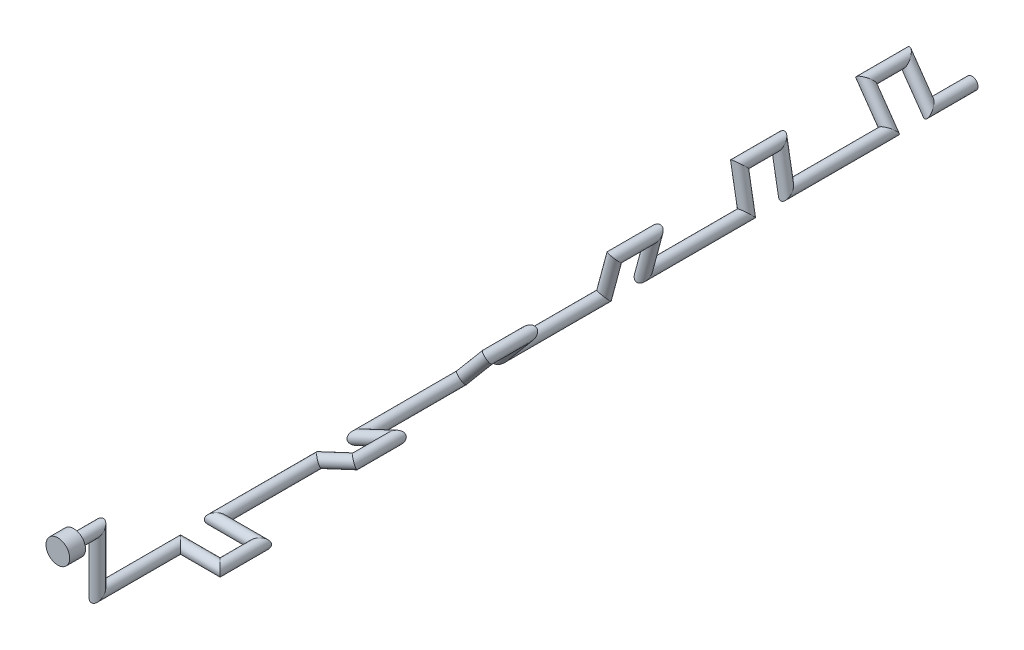
ISO-10303-21;
HEADER;
FILE_DESCRIPTION(('STEP AP214'),'2;1');
FILE_NAME('part.step','',(''),(''),'','','');
FILE_SCHEMA(('AUTOMOTIVE_DESIGN { 1 0 10303 214 1 1 1 1 }'));
ENDSEC;
DATA;
#1=APPLICATION_CONTEXT('core data for automotive mechanical design processes');
#2=APPLICATION_PROTOCOL_DEFINITION('international standard','automotive_design',2000,#1);
#3=PRODUCT_CONTEXT('',#1,'mechanical');
#4=PRODUCT('Part','Part','',(#3));
#5=PRODUCT_RELATED_PRODUCT_CATEGORY('part','',(#4));
#6=PRODUCT_DEFINITION_FORMATION('','',#4);
#7=PRODUCT_DEFINITION_CONTEXT('part definition',#1,'design');
#8=PRODUCT_DEFINITION('design','',#6,#7);
#9=PRODUCT_DEFINITION_SHAPE('','',#8);
#10=(LENGTH_UNIT() NAMED_UNIT(*) SI_UNIT(.MILLI.,.METRE.));
#11=(NAMED_UNIT(*) PLANE_ANGLE_UNIT() SI_UNIT($,.RADIAN.));
#12=(NAMED_UNIT(*) SI_UNIT($,.STERADIAN.) SOLID_ANGLE_UNIT());
#13=UNCERTAINTY_MEASURE_WITH_UNIT(LENGTH_MEASURE(1.E-05),#10,'distance_accuracy_value','');
#14=(GEOMETRIC_REPRESENTATION_CONTEXT(3) GLOBAL_UNCERTAINTY_ASSIGNED_CONTEXT((#13)) GLOBAL_UNIT_ASSIGNED_CONTEXT((#10,
#11,#12)) REPRESENTATION_CONTEXT('',''));
#15=CARTESIAN_POINT('',(0.,0.,0.));
#16=DIRECTION('',(0.,0.,1.));
#17=DIRECTION('',(1.,0.,0.));
#18=AXIS2_PLACEMENT_3D('',#15,#16,#17);
#19=CARTESIAN_POINT('',(0.,177.8,50.8));
#20=DIRECTION('',(0.,0.,-1.));
#21=DIRECTION('',(-1.,0.,0.));
#22=AXIS2_PLACEMENT_3D('',#19,#20,#21);
#23=CYLINDRICAL_SURFACE('',#22,38.1);
#24=CARTESIAN_POINT('',(0.,177.8,50.8));
#25=DIRECTION('',(0.,0.,1.));
#26=DIRECTION('',(1.,0.,0.));
#27=AXIS2_PLACEMENT_3D('',#24,#25,#26);
#28=CIRCLE('',#27,38.1);
#29=CARTESIAN_POINT('',(38.1,177.8,50.8));
#30=VERTEX_POINT('',#29);
#31=EDGE_CURVE('E41',#30,#30,#28,.T.);
#32=ORIENTED_EDGE('',*,*,#31,.F.);
#33=EDGE_LOOP('',(#32));
#34=FACE_BOUND('',#33,.T.);
#35=CARTESIAN_POINT('',(0.,177.8,0.));
#36=DIRECTION('',(0.,0.,1.));
#37=DIRECTION('',(1.,0.,0.));
#38=AXIS2_PLACEMENT_3D('',#35,#36,#37);
#39=CIRCLE('',#38,38.1);
#40=CARTESIAN_POINT('',(38.1,177.8,0.));
#41=VERTEX_POINT('',#40);
#42=EDGE_CURVE('E45',#41,#41,#39,.T.);
#43=ORIENTED_EDGE('',*,*,#42,.T.);
#44=EDGE_LOOP('',(#43));
#45=FACE_BOUND('',#44,.T.);
#46=ADVANCED_FACE('F30',(#34,#45),#23,.T.);
#47=CARTESIAN_POINT('',(0.,177.8,50.8));
#48=DIRECTION('',(0.,0.,1.));
#49=DIRECTION('',(1.,0.,0.));
#50=AXIS2_PLACEMENT_3D('',#47,#48,#49);
#51=PLANE('',#50);
#52=ORIENTED_EDGE('',*,*,#31,.T.);
#53=EDGE_LOOP('',(#52));
#54=FACE_BOUND('',#53,.T.);
#55=ADVANCED_FACE('F288',(#54),#51,.T.);
#56=CARTESIAN_POINT('',(0.,177.8,0.));
#57=DIRECTION('',(0.,0.,1.));
#58=DIRECTION('',(1.,0.,0.));
#59=AXIS2_PLACEMENT_3D('',#56,#57,#58);
#60=PLANE('',#59);
#61=CARTESIAN_POINT('',(0.,177.8,0.));
#62=DIRECTION('',(0.,0.,1.));
#63=DIRECTION('',(1.,0.,0.));
#64=AXIS2_PLACEMENT_3D('',#61,#62,#63);
#65=CIRCLE('',#64,31.75);
#66=CARTESIAN_POINT('',(31.75,177.8,0.));
#67=VERTEX_POINT('',#66);
#68=EDGE_CURVE('E10',#67,#67,#65,.T.);
#69=ORIENTED_EDGE('',*,*,#68,.T.);
#70=EDGE_LOOP('',(#69));
#71=FACE_BOUND('',#70,.T.);
#72=ORIENTED_EDGE('',*,*,#42,.F.);
#73=EDGE_LOOP('',(#72));
#74=FACE_BOUND('',#73,.T.);
#75=ADVANCED_FACE('F293',(#71,#74),#60,.F.);
#76=CARTESIAN_POINT('',(0.,0.,-34.19));
#77=DIRECTION('',(0.,0.,-1.));
#78=DIRECTION('',(0.,1.,0.));
#79=AXIS2_PLACEMENT_3D('',#76,#77,#78);
#80=CYLINDRICAL_SURFACE('',#79,19.05);
#81=CARTESIAN_POINT('',(0.,0.,-76.2));
#82=DIRECTION('',(0.,-0.707106781186548,-0.707106781186548));
#83=DIRECTION('',(0.,-0.707106781186548,0.707106781186548));
#84=AXIS2_PLACEMENT_3D('',#81,#82,#83);
#85=ELLIPSE('',#84,26.9407683632075,19.05);
#86=CARTESIAN_POINT('',(0.,-19.05,-57.15));
#87=VERTEX_POINT('',#86);
#88=EDGE_CURVE('E51',#87,#87,#85,.F.);
#89=ORIENTED_EDGE('',*,*,#88,.F.);
#90=EDGE_LOOP('',(#89));
#91=FACE_BOUND('',#90,.T.);
#92=CARTESIAN_POINT('',(0.,0.,-342.9));
#93=DIRECTION('',(0.707106781186547,0.,-0.707106781186547));
#94=DIRECTION('',(-0.707106781186548,0.,-0.707106781186548));
#95=AXIS2_PLACEMENT_3D('',#92,#93,#94);
#96=ELLIPSE('',#95,26.9407683632075,19.05);
#97=CARTESIAN_POINT('',(-19.05,0.,-361.95));
#98=VERTEX_POINT('',#97);
#99=EDGE_CURVE('E54',#98,#98,#96,.F.);
#100=ORIENTED_EDGE('',*,*,#99,.T.);
#101=EDGE_LOOP('',(#100));
#102=FACE_BOUND('',#101,.T.);
#103=ADVANCED_FACE('F132',(#91,#102),#80,.T.);
#104=CARTESIAN_POINT('',(0.,219.81,-76.2));
#105=DIRECTION('',(0.,-1.,0.));
#106=DIRECTION('',(0.,0.,-1.));
#107=AXIS2_PLACEMENT_3D('',#104,#105,#106);
#108=CYLINDRICAL_SURFACE('',#107,19.05);
#109=CARTESIAN_POINT('',(0.,177.8,-76.2));
#110=DIRECTION('',(0.,-0.707106781186548,-0.707106781186547));
#111=DIRECTION('',(0.,0.707106781186547,-0.707106781186548));
#112=AXIS2_PLACEMENT_3D('',#109,#110,#111);
#113=ELLIPSE('',#112,26.9407683632075,19.05);
#114=CARTESIAN_POINT('',(0.,196.85,-95.25));
#115=VERTEX_POINT('',#114);
#116=EDGE_CURVE('E49',#115,#115,#113,.F.);
#117=ORIENTED_EDGE('',*,*,#116,.F.);
#118=EDGE_LOOP('',(#117));
#119=FACE_BOUND('',#118,.T.);
#120=ORIENTED_EDGE('',*,*,#88,.T.);
#121=EDGE_LOOP('',(#120));
#122=FACE_BOUND('',#121,.T.);
#123=ADVANCED_FACE('F303',(#119,#122),#108,.T.);
#124=CARTESIAN_POINT('',(0.,177.8,0.));
#125=DIRECTION('',(0.,0.,-1.));
#126=DIRECTION('',(-1.,0.,0.));
#127=AXIS2_PLACEMENT_3D('',#124,#125,#126);
#128=CYLINDRICAL_SURFACE('',#127,19.05);
#129=CARTESIAN_POINT('',(0.,177.8,-12.7));
#130=DIRECTION('',(0.,0.,1.));
#131=DIRECTION('',(1.,0.,0.));
#132=AXIS2_PLACEMENT_3D('',#129,#130,#131);
#133=CIRCLE('',#132,19.05);
#134=CARTESIAN_POINT('',(19.05,177.8,-12.7));
#135=VERTEX_POINT('',#134);
#136=EDGE_CURVE('E37',#135,#135,#133,.F.);
#137=ORIENTED_EDGE('',*,*,#136,.T.);
#138=EDGE_LOOP('',(#137));
#139=FACE_BOUND('',#138,.T.);
#140=ORIENTED_EDGE('',*,*,#116,.T.);
#141=EDGE_LOOP('',(#140));
#142=FACE_BOUND('',#141,.T.);
#143=ADVANCED_FACE('F284',(#139,#142),#128,.T.);
#144=CARTESIAN_POINT('',(0.,177.8,-12.7));
#145=DIRECTION('',(0.,0.,1.));
#146=DIRECTION('',(1.,0.,0.));
#147=AXIS2_PLACEMENT_3D('',#144,#145,#146);
#148=TOROIDAL_SURFACE('',#147,31.75,12.7);
#149=ORIENTED_EDGE('',*,*,#68,.F.);
#150=EDGE_LOOP('',(#149));
#151=FACE_BOUND('',#150,.T.);
#152=ORIENTED_EDGE('',*,*,#136,.F.);
#153=EDGE_LOOP('',(#152));
#154=FACE_BOUND('',#153,.T.);
#155=ADVANCED_FACE('F32',(#151,#154),#148,.F.);
#156=CARTESIAN_POINT('',(-12.6999999999993,0.,-2895.6));
#157=DIRECTION('',(0.,0.,-1.));
#158=DIRECTION('',(-1.,0.,0.));
#159=AXIS2_PLACEMENT_3D('',#156,#157,#158);
#160=PLANE('',#159);
#161=CARTESIAN_POINT('',(-12.6999999999993,0.,-2895.6));
#162=DIRECTION('',(0.,0.,-1.));
#163=DIRECTION('',(-1.,0.,0.));
#164=AXIS2_PLACEMENT_3D('',#161,#162,#163);
#165=CIRCLE('',#164,19.05);
#166=CARTESIAN_POINT('',(-31.7499999999993,0.,-2895.6));
#167=VERTEX_POINT('',#166);
#168=EDGE_CURVE('E57',#167,#167,#165,.T.);
#169=ORIENTED_EDGE('',*,*,#168,.T.);
#170=EDGE_LOOP('',(#169));
#171=FACE_BOUND('',#170,.T.);
#172=ADVANCED_FACE('F275',(#171),#160,.T.);
#173=CARTESIAN_POINT('',(-12.6999999999993,0.,-2709.45004360013));
#174=DIRECTION('',(0.,0.,-1.));
#175=DIRECTION('',(0.,1.,0.));
#176=AXIS2_PLACEMENT_3D('',#173,#174,#175);
#177=CYLINDRICAL_SURFACE('',#176,19.05);
#178=CARTESIAN_POINT('',(-12.6999999999994,3.60822483003176E-13,-2755.9));
#179=DIRECTION('',(0.405579787672585,-0.57922796533948,-0.707106781186651));
#180=DIRECTION('',(0.405579787672705,-0.57922796533965,0.707106781186444));
#181=AXIS2_PLACEMENT_3D('',#178,#179,#180);
#182=ELLIPSE('',#181,26.9407683632035,19.05);
#183=CARTESIAN_POINT('',(-1.77336888751184,-15.6048464437048,-2736.85000000001));
#184=VERTEX_POINT('',#183);
#185=EDGE_CURVE('E60',#184,#184,#182,.F.);
#186=ORIENTED_EDGE('',*,*,#185,.F.);
#187=EDGE_LOOP('',(#186));
#188=FACE_BOUND('',#187,.T.);
#189=ORIENTED_EDGE('',*,*,#168,.F.);
#190=EDGE_LOOP('',(#189));
#191=FACE_BOUND('',#190,.T.);
#192=ADVANCED_FACE('F269',(#188,#191),#177,.T.);
#193=CARTESIAN_POINT('',(-112.186807877084,142.081886366792,-2755.89999999995));
#194=DIRECTION('',(0.573576436351055,-0.819152044288986,-2.93728296278784E-13));
#195=DIRECTION('',(0.819152044288986,0.573576436351055,0.));
#196=AXIS2_PLACEMENT_3D('',#193,#194,#195);
#197=CYLINDRICAL_SURFACE('',#196,19.05);
#198=CARTESIAN_POINT('',(-85.5442074165833,104.032309624701,-2755.89999999996));
#199=DIRECTION('',(0.405579787672586,-0.57922796533948,-0.707106781186651));
#200=DIRECTION('',(-0.405579787672705,0.57922796533965,-0.707106781186444));
#201=AXIS2_PLACEMENT_3D('',#198,#199,#200);
#202=ELLIPSE('',#201,26.9407683632035,19.05);
#203=CARTESIAN_POINT('',(-96.4708385290709,119.637156068406,-2774.94999999996));
#204=VERTEX_POINT('',#203);
#205=EDGE_CURVE('E63',#204,#204,#202,.F.);
#206=ORIENTED_EDGE('',*,*,#205,.F.);
#207=EDGE_LOOP('',(#206));
#208=FACE_BOUND('',#207,.T.);
#209=ORIENTED_EDGE('',*,*,#185,.T.);
#210=EDGE_LOOP('',(#209));
#211=FACE_BOUND('',#210,.T.);
#212=ADVANCED_FACE('F263',(#208,#211),#197,.T.);
#213=CARTESIAN_POINT('',(-85.5442074165833,104.032309624701,-2582.45004360006));
#214=DIRECTION('',(0.,0.,-1.));
#215=DIRECTION('',(-1.,0.,0.));
#216=AXIS2_PLACEMENT_3D('',#213,#214,#215);
#217=CYLINDRICAL_SURFACE('',#216,19.05);
#218=CARTESIAN_POINT('',(-85.5442074165832,104.0323096247,-2628.89999999996));
#219=DIRECTION('',(-0.405579787672705,0.57922796533965,-0.707106781186444));
#220=DIRECTION('',(-0.405579787672586,0.57922796533948,0.707106781186651));
#221=AXIS2_PLACEMENT_3D('',#218,#219,#220);
#222=ELLIPSE('',#221,26.9407683632114,19.05);
#223=CARTESIAN_POINT('',(-96.4708385290708,119.637156068406,-2609.84999999996));
#224=VERTEX_POINT('',#223);
#225=EDGE_CURVE('E66',#224,#224,#222,.F.);
#226=ORIENTED_EDGE('',*,*,#225,.F.);
#227=EDGE_LOOP('',(#226));
#228=FACE_BOUND('',#227,.T.);
#229=ORIENTED_EDGE('',*,*,#205,.T.);
#230=EDGE_LOOP('',(#229));
#231=FACE_BOUND('',#230,.T.);
#232=ADVANCED_FACE('F257',(#228,#231),#217,.T.);
#233=CARTESIAN_POINT('',(13.9426004605176,-38.0495767421136,-2628.90000000001));
#234=DIRECTION('',(-0.573576436351055,0.819152044288986,2.93728296278784E-13));
#235=DIRECTION('',(-0.819152044288986,-0.573576436351055,0.));
#236=AXIS2_PLACEMENT_3D('',#233,#234,#235);
#237=CYLINDRICAL_SURFACE('',#236,19.05);
#238=CARTESIAN_POINT('',(-12.7000000000002,4.19911501403636E-13,-2628.9));
#239=DIRECTION('',(-0.405579787672705,0.57922796533965,-0.707106781186444));
#240=DIRECTION('',(0.405579787672586,-0.57922796533948,-0.707106781186651));
#241=AXIS2_PLACEMENT_3D('',#238,#239,#240);
#242=ELLIPSE('',#241,26.9407683632114,19.05);
#243=CARTESIAN_POINT('',(-1.77336888751256,-15.6048464437048,-2647.95000000001));
#244=VERTEX_POINT('',#243);
#245=EDGE_CURVE('E69',#244,#244,#242,.F.);
#246=ORIENTED_EDGE('',*,*,#245,.F.);
#247=EDGE_LOOP('',(#246));
#248=FACE_BOUND('',#247,.T.);
#249=ORIENTED_EDGE('',*,*,#225,.T.);
#250=EDGE_LOOP('',(#249));
#251=FACE_BOUND('',#250,.T.);
#252=ADVANCED_FACE('F251',(#248,#251),#237,.T.);
#253=CARTESIAN_POINT('',(-12.7000000000002,4.47385058428118E-13,-2253.68790950824));
#254=DIRECTION('',(0.,0.,-1.));
#255=DIRECTION('',(0.,1.,0.));
#256=AXIS2_PLACEMENT_3D('',#253,#254,#255);
#257=CYLINDRICAL_SURFACE('',#256,19.05);
#258=CARTESIAN_POINT('',(-12.7000000000001,6.10622663543836E-13,-2298.7));
#259=DIRECTION('',(0.122787803968986,-0.696364240320073,-0.707106781186492));
#260=DIRECTION('',(0.122787803968967,-0.696364240319963,0.707106781186603));
#261=AXIS2_PLACEMENT_3D('',#258,#259,#260);
#262=ELLIPSE('',#261,26.9407683632096,19.05);
#263=CARTESIAN_POINT('',(-9.39200221544497,-18.7605876948819,-2279.65));
#264=VERTEX_POINT('',#263);
#265=EDGE_CURVE('E72',#264,#264,#262,.F.);
#266=ORIENTED_EDGE('',*,*,#265,.F.);
#267=EDGE_LOOP('',(#266));
#268=FACE_BOUND('',#267,.T.);
#269=ORIENTED_EDGE('',*,*,#245,.T.);
#270=EDGE_LOOP('',(#269));
#271=FACE_BOUND('',#270,.T.);
#272=ADVANCED_FACE('F245',(#268,#271),#257,.T.);
#273=CARTESIAN_POINT('',(-42.569586050574,169.398840328121,-2298.70000000003));
#274=DIRECTION('',(0.173648177666936,-0.984807753012207,1.57354444435063E-13));
#275=DIRECTION('',(0.984807753012207,0.173648177666936,0.));
#276=AXIS2_PLACEMENT_3D('',#273,#274,#275);
#277=CYLINDRICAL_SURFACE('',#276,19.05);
#278=CARTESIAN_POINT('',(-34.7533185637007,125.070584632549,-2298.70000000002));
#279=DIRECTION('',(0.122787803968986,-0.696364240320073,-0.707106781186492));
#280=DIRECTION('',(-0.122787803968967,0.696364240319964,-0.707106781186603));
#281=AXIS2_PLACEMENT_3D('',#278,#279,#280);
#282=ELLIPSE('',#281,26.9407683632096,19.05);
#283=CARTESIAN_POINT('',(-38.0613163482559,143.831172327432,-2317.75000000002));
#284=VERTEX_POINT('',#283);
#285=EDGE_CURVE('E75',#284,#284,#282,.F.);
#286=ORIENTED_EDGE('',*,*,#285,.F.);
#287=EDGE_LOOP('',(#286));
#288=FACE_BOUND('',#287,.T.);
#289=ORIENTED_EDGE('',*,*,#265,.T.);
#290=EDGE_LOOP('',(#289));
#291=FACE_BOUND('',#290,.T.);
#292=ADVANCED_FACE('F239',(#288,#291),#277,.T.);
#293=CARTESIAN_POINT('',(-34.7533185637007,125.070584632549,-2126.68790950827));
#294=DIRECTION('',(0.,0.,-1.));
#295=DIRECTION('',(-1.,0.,0.));
#296=AXIS2_PLACEMENT_3D('',#293,#294,#295);
#297=CYLINDRICAL_SURFACE('',#296,19.05);
#298=CARTESIAN_POINT('',(-34.7533185637008,125.070584632549,-2171.70000000002));
#299=DIRECTION('',(-0.122787803968967,0.696364240319963,-0.707106781186603));
#300=DIRECTION('',(-0.122787803968986,0.696364240320073,0.707106781186492));
#301=AXIS2_PLACEMENT_3D('',#298,#299,#300);
#302=ELLIPSE('',#301,26.9407683632053,19.05);
#303=CARTESIAN_POINT('',(-38.0613163482559,143.831172327432,-2152.65000000002));
#304=VERTEX_POINT('',#303);
#305=EDGE_CURVE('E78',#304,#304,#302,.F.);
#306=ORIENTED_EDGE('',*,*,#305,.F.);
#307=EDGE_LOOP('',(#306));
#308=FACE_BOUND('',#307,.T.);
#309=ORIENTED_EDGE('',*,*,#285,.T.);
#310=EDGE_LOOP('',(#309));
#311=FACE_BOUND('',#310,.T.);
#312=ADVANCED_FACE('F233',(#308,#311),#297,.T.);
#313=CARTESIAN_POINT('',(-4.88373251312936,-44.3282556955576,-2171.69999999999));
#314=DIRECTION('',(-0.173648177666936,0.984807753012207,-1.57354444435063E-13));
#315=DIRECTION('',(-0.984807753012207,-0.173648177666936,0.));
#316=AXIS2_PLACEMENT_3D('',#313,#314,#315);
#317=CYLINDRICAL_SURFACE('',#316,19.05);
#318=CARTESIAN_POINT('',(-12.7000000000001,1.97758476261356E-13,-2171.7));
#319=DIRECTION('',(-0.122787803968967,0.696364240319963,-0.707106781186603));
#320=DIRECTION('',(0.122787803968986,-0.696364240320073,-0.707106781186492));
#321=AXIS2_PLACEMENT_3D('',#318,#319,#320);
#322=ELLIPSE('',#321,26.9407683632053,19.05);
#323=CARTESIAN_POINT('',(-9.39200221544497,-18.7605876948824,-2190.75));
#324=VERTEX_POINT('',#323);
#325=EDGE_CURVE('E81',#324,#324,#322,.F.);
#326=ORIENTED_EDGE('',*,*,#325,.F.);
#327=EDGE_LOOP('',(#326));
#328=FACE_BOUND('',#327,.T.);
#329=ORIENTED_EDGE('',*,*,#305,.T.);
#330=EDGE_LOOP('',(#329));
#331=FACE_BOUND('',#330,.T.);
#332=ADVANCED_FACE('F227',(#328,#331),#317,.T.);
#333=CARTESIAN_POINT('',(-12.7000000000001,2.25428298446513E-13,-1795.4944955301));
#334=DIRECTION('',(0.,0.,-1.));
#335=DIRECTION('',(0.,1.,0.));
#336=AXIS2_PLACEMENT_3D('',#333,#334,#335);
#337=CYLINDRICAL_SURFACE('',#336,19.05);
#338=CARTESIAN_POINT('',(-12.7000000000002,3.60822483003176E-13,-1841.5));
#339=DIRECTION('',(-0.183012701892218,-0.683012701892222,-0.707106781186545));
#340=DIRECTION('',(-0.183012701892217,-0.683012701892217,0.70710678118655));
#341=AXIS2_PLACEMENT_3D('',#338,#339,#340);
#342=ELLIPSE('',#341,26.9407683632076,19.05);
#343=CARTESIAN_POINT('',(-17.6305028092032,-18.4008869908064,-1822.45));
#344=VERTEX_POINT('',#343);
#345=EDGE_CURVE('E84',#344,#344,#342,.F.);
#346=ORIENTED_EDGE('',*,*,#345,.F.);
#347=EDGE_LOOP('',(#346));
#348=FACE_BOUND('',#347,.T.);
#349=ORIENTED_EDGE('',*,*,#325,.T.);
#350=EDGE_LOOP('',(#349));
#351=FACE_BOUND('',#350,.T.);
#352=ADVANCED_FACE('F221',(#348,#351),#337,.T.);
#353=CARTESIAN_POINT('',(32.0771194643783,167.110484857644,-1841.5));
#354=DIRECTION('',(-0.258819045102519,-0.965925826289069,0.));
#355=DIRECTION('',(0.965925826289069,-0.258819045102519,0.));
#356=AXIS2_PLACEMENT_3D('',#353,#354,#355);
#357=CYLINDRICAL_SURFACE('',#356,19.05);
#358=CARTESIAN_POINT('',(20.1700187280195,122.672579938711,-1841.5));
#359=DIRECTION('',(-0.183012701892219,-0.683012701892222,-0.707106781186545));
#360=DIRECTION('',(0.183012701892217,0.683012701892217,-0.70710678118655));
#361=AXIS2_PLACEMENT_3D('',#358,#359,#360);
#362=ELLIPSE('',#361,26.9407683632076,19.05);
#363=CARTESIAN_POINT('',(25.1005215372225,141.073466929518,-1860.55));
#364=VERTEX_POINT('',#363);
#365=EDGE_CURVE('E87',#364,#364,#362,.F.);
#366=ORIENTED_EDGE('',*,*,#365,.F.);
#367=EDGE_LOOP('',(#366));
#368=FACE_BOUND('',#367,.T.);
#369=ORIENTED_EDGE('',*,*,#345,.T.);
#370=EDGE_LOOP('',(#369));
#371=FACE_BOUND('',#370,.T.);
#372=ADVANCED_FACE('F215',(#368,#371),#357,.T.);
#373=CARTESIAN_POINT('',(20.1700187280196,122.672579938711,-1668.4944955301));
#374=DIRECTION('',(0.,0.,-1.));
#375=DIRECTION('',(-1.,0.,0.));
#376=AXIS2_PLACEMENT_3D('',#373,#374,#375);
#377=CYLINDRICAL_SURFACE('',#376,19.05);
#378=CARTESIAN_POINT('',(20.1700187280331,122.672579938597,-1714.50000000011));
#379=DIRECTION('',(0.183012701892217,0.683012701892216,-0.707106781186551));
#380=DIRECTION('',(0.183012701892219,0.683012701892223,0.707106781186544));
#381=AXIS2_PLACEMENT_3D('',#378,#379,#380);
#382=ELLIPSE('',#381,26.9407683632073,19.05);
#383=CARTESIAN_POINT('',(25.100521537236,141.073466929404,-1695.45000000011));
#384=VERTEX_POINT('',#383);
#385=EDGE_CURVE('E90',#384,#384,#382,.F.);
#386=ORIENTED_EDGE('',*,*,#385,.F.);
#387=EDGE_LOOP('',(#386));
#388=FACE_BOUND('',#387,.T.);
#389=ORIENTED_EDGE('',*,*,#365,.T.);
#390=EDGE_LOOP('',(#389));
#391=FACE_BOUND('',#390,.T.);
#392=ADVANCED_FACE('F209',(#388,#391),#377,.T.);
#393=CARTESIAN_POINT('',(-24.6071007363344,-44.4379049190045,-1714.50000000011));
#394=DIRECTION('',(0.258819045102519,0.965925826289069,0.));
#395=DIRECTION('',(-0.965925826289069,0.258819045102519,0.));
#396=AXIS2_PLACEMENT_3D('',#393,#394,#395);
#397=CYLINDRICAL_SURFACE('',#396,19.05);
#398=CARTESIAN_POINT('',(-12.6999999999866,-1.13666999346707E-10,-1714.50000000011));
#399=DIRECTION('',(0.183012701892109,0.683012701892465,-0.707106781186339));
#400=DIRECTION('',(-0.183012701892327,-0.683012701891975,-0.707106781186756));
#401=AXIS2_PLACEMENT_3D('',#398,#399,#400);
#402=ELLIPSE('',#401,26.9407683631993,19.05);
#403=CARTESIAN_POINT('',(-17.630502809191,-18.4008869909082,-1733.55000000011));
#404=VERTEX_POINT('',#403);
#405=EDGE_CURVE('E93',#404,#404,#402,.F.);
#406=ORIENTED_EDGE('',*,*,#405,.F.);
#407=EDGE_LOOP('',(#406));
#408=FACE_BOUND('',#407,.T.);
#409=ORIENTED_EDGE('',*,*,#385,.T.);
#410=EDGE_LOOP('',(#409));
#411=FACE_BOUND('',#410,.T.);
#412=ADVANCED_FACE('F203',(#408,#411),#397,.T.);
#413=CARTESIAN_POINT('',(-12.6999999999581,-3.54790291332123E-10,-1338.27955414889));
#414=DIRECTION('',(0.,6.40909590758314E-13,-1.));
#415=DIRECTION('',(0.,1.,6.40909590758314E-13));
#416=AXIS2_PLACEMENT_3D('',#413,#414,#415);
#417=CYLINDRICAL_SURFACE('',#416,19.05);
#418=CARTESIAN_POINT('',(-12.699999999975,-2.11303197161783E-10,-1384.3));
#419=DIRECTION('',(-0.456248949535373,-0.543709797218632,-0.704426399602075));
#420=DIRECTION('',(-0.452809525247148,-0.53961105094484,0.709777040727339));
#421=AXIS2_PLACEMENT_3D('',#418,#419,#420);
#422=ELLIPSE('',#421,27.0432794835198,19.05);
#423=CARTESIAN_POINT('',(-24.9454545440336,-14.5928524633084,-1365.10530111663));
#424=VERTEX_POINT('',#423);
#425=EDGE_CURVE('E96',#424,#424,#422,.F.);
#426=ORIENTED_EDGE('',*,*,#425,.F.);
#427=EDGE_LOOP('',(#426));
#428=FACE_BOUND('',#427,.T.);
#429=ORIENTED_EDGE('',*,*,#405,.T.);
#430=EDGE_LOOP('',(#429));
#431=FACE_BOUND('',#430,.T.);
#432=ADVANCED_FACE('F197',(#428,#431),#417,.T.);
#433=CARTESIAN_POINT('',(98.5153988155062,132.534884735834,-1385.60922756179));
#434=DIRECTION('',(-0.642787609686502,-0.76600706976649,0.00756689508775858));
#435=DIRECTION('',(0.76602900068687,-0.642806012811545,0.));
#436=AXIS2_PLACEMENT_3D('',#433,#434,#435);
#437=CYLINDRICAL_SURFACE('',#436,19.05);
#438=CARTESIAN_POINT('',(68.9340264302142,97.2828978601372,-1385.26099567615));
#439=DIRECTION('',(-0.456248949535218,-0.543709797218966,-0.704426399601918));
#440=DIRECTION('',(0.452809525247301,0.539611050944507,-0.709777040727494));
#441=AXIS2_PLACEMENT_3D('',#438,#439,#440);
#442=ELLIPSE('',#441,27.0432794835138,19.05);
#443=CARTESIAN_POINT('',(81.1794809742741,111.875750323222,-1404.45569455952));
#444=VERTEX_POINT('',#443);
#445=EDGE_CURVE('E99',#444,#444,#442,.F.);
#446=ORIENTED_EDGE('',*,*,#445,.F.);
#447=EDGE_LOOP('',(#446));
#448=FACE_BOUND('',#447,.T.);
#449=ORIENTED_EDGE('',*,*,#425,.T.);
#450=EDGE_LOOP('',(#449));
#451=FACE_BOUND('',#450,.T.);
#452=ADVANCED_FACE('F191',(#448,#451),#437,.T.);
#453=CARTESIAN_POINT('',(68.9340264302142,97.2828978601372,-1212.93028109323));
#454=DIRECTION('',(0.,0.,-1.));
#455=DIRECTION('',(-1.,0.,0.));
#456=AXIS2_PLACEMENT_3D('',#453,#454,#455);
#457=CYLINDRICAL_SURFACE('',#456,19.05);
#458=CARTESIAN_POINT('',(68.9340264302024,97.2828978601948,-1258.2609956761));
#459=DIRECTION('',(0.452809525247322,0.539611050944536,-0.709777040727459));
#460=DIRECTION('',(0.456248949535193,0.54370979721894,0.704426399601954));
#461=AXIS2_PLACEMENT_3D('',#458,#459,#460);
#462=ELLIPSE('',#461,26.8394142200985,19.05);
#463=CARTESIAN_POINT('',(81.1794809742623,111.87575032328,-1239.35460374961));
#464=VERTEX_POINT('',#463);
#465=EDGE_CURVE('E102',#464,#464,#462,.F.);
#466=ORIENTED_EDGE('',*,*,#465,.F.);
#467=EDGE_LOOP('',(#466));
#468=FACE_BOUND('',#467,.T.);
#469=ORIENTED_EDGE('',*,*,#445,.T.);
#470=EDGE_LOOP('',(#469));
#471=FACE_BOUND('',#470,.T.);
#472=ADVANCED_FACE('F185',(#468,#471),#457,.T.);
#473=CARTESIAN_POINT('',(-41.8380216721253,-34.7236478482409,-1256.95698723846));
#474=DIRECTION('',(0.6427876096865,0.766007069766493,-0.00756689508765715));
#475=DIRECTION('',(-0.766029000686872,0.642806012811542,0.));
#476=AXIS2_PLACEMENT_3D('',#473,#474,#475);
#477=CYLINDRICAL_SURFACE('',#476,19.05);
#478=CARTESIAN_POINT('',(-12.6999999999866,-1.54324247583433E-10,-1257.29999999996));
#479=DIRECTION('',(0.452809525247414,0.539611050944362,-0.709777040727532));
#480=DIRECTION('',(-0.4562489495351,-0.543709797219114,-0.70442639960188));
#481=AXIS2_PLACEMENT_3D('',#478,#479,#480);
#482=ELLIPSE('',#481,26.8394142201013,19.05);
#483=CARTESIAN_POINT('',(-24.9454545440452,-14.5928524632454,-1276.20639192645));
#484=VERTEX_POINT('',#483);
#485=EDGE_CURVE('E105',#484,#484,#482,.F.);
#486=ORIENTED_EDGE('',*,*,#485,.F.);
#487=EDGE_LOOP('',(#486));
#488=FACE_BOUND('',#487,.T.);
#489=ORIENTED_EDGE('',*,*,#465,.T.);
#490=EDGE_LOOP('',(#489));
#491=FACE_BOUND('',#490,.T.);
#492=ADVANCED_FACE('F179',(#488,#491),#477,.T.);
#493=CARTESIAN_POINT('',(-12.7000000000104,-3.50078667269193E-11,-890.14291747647));
#494=DIRECTION('',(0.,-3.2497365987453E-13,-1.));
#495=DIRECTION('',(0.,1.,-3.2497365987453E-13));
#496=AXIS2_PLACEMENT_3D('',#493,#494,#495);
#497=CYLINDRICAL_SURFACE('',#496,19.05);
#498=CARTESIAN_POINT('',(-12.700000000001,-1.01460506662931E-10,-927.099999999996));
#499=DIRECTION('',(-0.642202421133037,-0.299449205977292,-0.705624704308483));
#500=DIRECTION('',(-0.63951877143843,-0.2981978610056,0.708585758161682));
#501=AXIS2_PLACEMENT_3D('',#498,#499,#500);
#502=ELLIPSE('',#501,26.9973540944369,19.05);
#503=CARTESIAN_POINT('',(-29.9653147225636,-8.05055324387335,-907.97005938063));
#504=VERTEX_POINT('',#503);
#505=EDGE_CURVE('E108',#504,#504,#502,.F.);
#506=ORIENTED_EDGE('',*,*,#505,.F.);
#507=EDGE_LOOP('',(#506));
#508=FACE_BOUND('',#507,.T.);
#509=ORIENTED_EDGE('',*,*,#485,.T.);
#510=EDGE_LOOP('',(#509));
#511=FACE_BOUND('',#510,.T.);
#512=ADVANCED_FACE('F173',(#508,#511),#497,.T.);
#513=CARTESIAN_POINT('',(135.895580630879,69.2878556157471,-927.786579028379));
#514=DIRECTION('',(-0.906307787036519,-0.422597514845982,0.00418755333905197));
#515=DIRECTION('',(0.422601220145831,-0.906315733467788,0.));
#516=AXIS2_PLACEMENT_3D('',#513,#514,#515);
#517=CYLINDRICAL_SURFACE('',#516,19.05);
#518=CARTESIAN_POINT('',(102.401088953648,53.6698843853435,-927.631819274055));
#519=DIRECTION('',(-0.642202421133095,-0.299449205977089,-0.705624704308517));
#520=DIRECTION('',(0.639518771438373,0.298197861005803,-0.708585758161649));
#521=AXIS2_PLACEMENT_3D('',#518,#519,#520);
#522=ELLIPSE('',#521,26.9973540944382,19.05);
#523=CARTESIAN_POINT('',(119.66640367621,61.7204376291212,-946.761759893422));
#524=VERTEX_POINT('',#523);
#525=EDGE_CURVE('E111',#524,#524,#522,.F.);
#526=ORIENTED_EDGE('',*,*,#525,.F.);
#527=EDGE_LOOP('',(#526));
#528=FACE_BOUND('',#527,.T.);
#529=ORIENTED_EDGE('',*,*,#505,.T.);
#530=EDGE_LOOP('',(#529));
#531=FACE_BOUND('',#530,.T.);
#532=ADVANCED_FACE('F167',(#528,#531),#517,.T.);
#533=CARTESIAN_POINT('',(102.401088953644,53.6698843853465,-763.982131516532));
#534=DIRECTION('',(0.,0.,-1.));
#535=DIRECTION('',(-1.,0.,0.));
#536=AXIS2_PLACEMENT_3D('',#533,#534,#535);
#537=CYLINDRICAL_SURFACE('',#536,19.05);
#538=CARTESIAN_POINT('',(102.401088953644,53.6698843853716,-800.631819274047));
#539=DIRECTION('',(0.639518771438507,0.298197861005554,-0.708585758161632));
#540=DIRECTION('',(0.6422024211332,0.299449205976825,0.705624704308534));
#541=AXIS2_PLACEMENT_3D('',#538,#539,#540);
#542=ELLIPSE('',#541,26.8845369534711,19.05);
#543=CARTESIAN_POINT('',(119.666403676208,61.7204376291431,-781.661425835782));
#544=VERTEX_POINT('',#543);
#545=EDGE_CURVE('E114',#544,#544,#542,.F.);
#546=ORIENTED_EDGE('',*,*,#545,.F.);
#547=EDGE_LOOP('',(#546));
#548=FACE_BOUND('',#547,.T.);
#549=ORIENTED_EDGE('',*,*,#525,.T.);
#550=EDGE_LOOP('',(#549));
#551=FACE_BOUND('',#550,.T.);
#552=ADVANCED_FACE('F161',(#548,#551),#537,.T.);
#553=CARTESIAN_POINT('',(-45.9158974071368,-15.488066966226,-799.946527477651));
#554=DIRECTION('',(0.906307787036688,0.422597514845619,-0.00418755333900407));
#555=DIRECTION('',(-0.422601220145468,0.906315733467957,0.));
#556=AXIS2_PLACEMENT_3D('',#553,#554,#555);
#557=CYLINDRICAL_SURFACE('',#556,19.05);
#558=CARTESIAN_POINT('',(-12.7000000000222,-2.50251936909275E-11,-800.099999999993));
#559=DIRECTION('',(0.63951877143853,0.29819786100546,-0.708585758161651));
#560=DIRECTION('',(-0.642202421133177,-0.299449205976919,-0.705624704308514));
#561=AXIS2_PLACEMENT_3D('',#558,#559,#560);
#562=ELLIPSE('',#561,26.8845369534718,19.05);
#563=CARTESIAN_POINT('',(-29.9653147225862,-8.0505532437993,-819.070393438258));
#564=VERTEX_POINT('',#563);
#565=EDGE_CURVE('E117',#564,#564,#562,.F.);
#566=ORIENTED_EDGE('',*,*,#565,.F.);
#567=EDGE_LOOP('',(#566));
#568=FACE_BOUND('',#567,.T.);
#569=ORIENTED_EDGE('',*,*,#545,.T.);
#570=EDGE_LOOP('',(#569));
#571=FACE_BOUND('',#570,.T.);
#572=ADVANCED_FACE('F155',(#568,#571),#557,.T.);
#573=CARTESIAN_POINT('',(-12.7000000000336,3.22724145538284E-11,-448.844999999987));
#574=DIRECTION('',(0.,-1.63122541301205E-13,-1.));
#575=DIRECTION('',(0.,1.,-1.63122541301205E-13));
#576=AXIS2_PLACEMENT_3D('',#573,#574,#575);
#577=CYLINDRICAL_SURFACE('',#576,19.05);
#578=CARTESIAN_POINT('',(-12.7000000000272,-1.65318396624944E-13,-469.9));
#579=DIRECTION('',(-0.707106781186536,-1.16717123630821E-13,-0.707106781186559));
#580=DIRECTION('',(-0.707106781186559,1.13972986606109E-13,0.707106781186536));
#581=AXIS2_PLACEMENT_3D('',#578,#579,#580);
#582=ELLIPSE('',#581,26.9407683632079,19.05);
#583=CARTESIAN_POINT('',(-31.7500000000278,2.90520143519324E-12,-450.85));
#584=VERTEX_POINT('',#583);
#585=EDGE_CURVE('E120',#584,#584,#582,.F.);
#586=ORIENTED_EDGE('',*,*,#585,.F.);
#587=EDGE_LOOP('',(#586));
#588=FACE_BOUND('',#587,.T.);
#589=ORIENTED_EDGE('',*,*,#565,.T.);
#590=EDGE_LOOP('',(#589));
#591=FACE_BOUND('',#590,.T.);
#592=ADVANCED_FACE('F149',(#588,#591),#577,.T.);
#593=CARTESIAN_POINT('',(148.055,1.46610267576769E-13,-469.9));
#594=DIRECTION('',(-1.,0.,0.));
#595=DIRECTION('',(0.,-1.,0.));
#596=AXIS2_PLACEMENT_3D('',#593,#594,#595);
#597=CYLINDRICAL_SURFACE('',#596,19.05);
#598=CARTESIAN_POINT('',(127.,1.05755189820145E-13,-469.9));
#599=DIRECTION('',(-0.707106781186548,0.,-0.707106781186548));
#600=DIRECTION('',(0.707106781186548,0.,-0.707106781186548));
#601=AXIS2_PLACEMENT_3D('',#598,#599,#600);
#602=ELLIPSE('',#601,26.9407683632075,19.05);
#603=CARTESIAN_POINT('',(146.05,1.42719769789923E-13,-488.95));
#604=VERTEX_POINT('',#603);
#605=EDGE_CURVE('E123',#604,#604,#602,.F.);
#606=ORIENTED_EDGE('',*,*,#605,.F.);
#607=EDGE_LOOP('',(#606));
#608=FACE_BOUND('',#607,.T.);
#609=ORIENTED_EDGE('',*,*,#585,.T.);
#610=EDGE_LOOP('',(#609));
#611=FACE_BOUND('',#610,.T.);
#612=ADVANCED_FACE('F143',(#608,#611),#597,.T.);
#613=CARTESIAN_POINT('',(127.,1.05755189820145E-13,-321.845));
#614=DIRECTION('',(0.,0.,-1.));
#615=DIRECTION('',(-1.,0.,0.));
#616=AXIS2_PLACEMENT_3D('',#613,#614,#615);
#617=CYLINDRICAL_SURFACE('',#616,19.05);
#618=CARTESIAN_POINT('',(127.,1.20173532020197E-13,-342.9));
#619=DIRECTION('',(0.707106781186548,0.,-0.707106781186548));
#620=DIRECTION('',(0.707106781186548,0.,0.707106781186548));
#621=AXIS2_PLACEMENT_3D('',#618,#619,#620);
#622=ELLIPSE('',#621,26.9407683632075,19.05);
#623=CARTESIAN_POINT('',(146.05,1.28884096757232E-13,-323.85));
#624=VERTEX_POINT('',#623);
#625=EDGE_CURVE('E126',#624,#624,#622,.F.);
#626=ORIENTED_EDGE('',*,*,#625,.F.);
#627=EDGE_LOOP('',(#626));
#628=FACE_BOUND('',#627,.T.);
#629=ORIENTED_EDGE('',*,*,#605,.T.);
#630=EDGE_LOOP('',(#629));
#631=FACE_BOUND('',#630,.T.);
#632=ADVANCED_FACE('F137',(#628,#631),#617,.T.);
#633=CARTESIAN_POINT('',(-21.055,0.,-342.9));
#634=DIRECTION('',(1.,0.,0.));
#635=DIRECTION('',(0.,1.,0.));
#636=AXIS2_PLACEMENT_3D('',#633,#634,#635);
#637=CYLINDRICAL_SURFACE('',#636,19.05);
#638=ORIENTED_EDGE('',*,*,#99,.F.);
#639=EDGE_LOOP('',(#638));
#640=FACE_BOUND('',#639,.T.);
#641=ORIENTED_EDGE('',*,*,#625,.T.);
#642=EDGE_LOOP('',(#641));
#643=FACE_BOUND('',#642,.T.);
#644=ADVANCED_FACE('F134',(#640,#643),#637,.T.);
#645=CLOSED_SHELL('',(#46,#55,#75,#103,#123,#143,#155,#172,#192,#212,#232,#252,#272,#292,#312,
#332,#352,#372,#392,#412,#432,#452,#472,#492,#512,#532,#552,#572,#592,#612,#632,#644));
#646=MANIFOLD_SOLID_BREP('B2',#645);
#647=ADVANCED_BREP_SHAPE_REPRESENTATION('',(#18,#646),#14);
#648=SHAPE_DEFINITION_REPRESENTATION(#9,#647);
ENDSEC;
END-ISO-10303-21;
